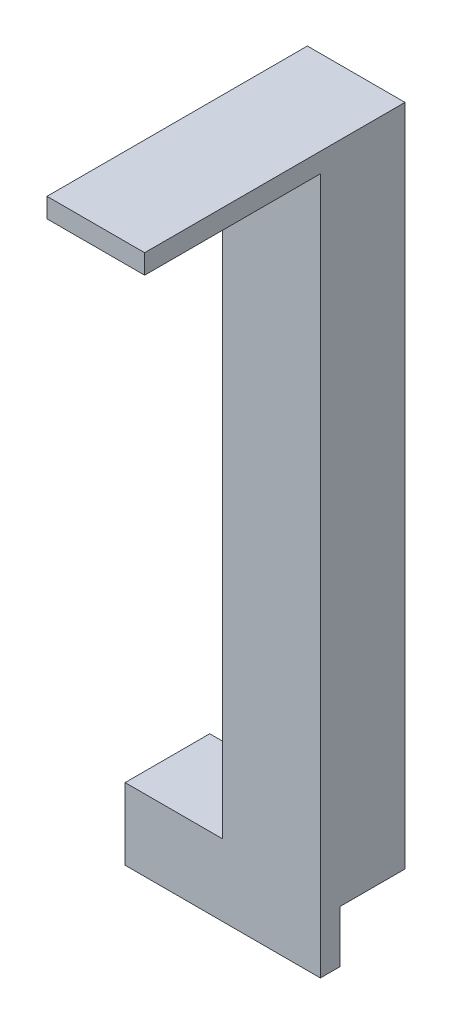
ISO-10303-21;
HEADER;
FILE_DESCRIPTION(('STEP AP214'),'2;1');
FILE_NAME('part.step','',(''),(''),'','','');
FILE_SCHEMA(('AUTOMOTIVE_DESIGN { 1 0 10303 214 1 1 1 1 }'));
ENDSEC;
DATA;
#1=APPLICATION_CONTEXT('core data for automotive mechanical design processes');
#2=APPLICATION_PROTOCOL_DEFINITION('international standard','automotive_design',2000,#1);
#3=PRODUCT_CONTEXT('',#1,'mechanical');
#4=PRODUCT('Part','Part','',(#3));
#5=PRODUCT_RELATED_PRODUCT_CATEGORY('part','',(#4));
#6=PRODUCT_DEFINITION_FORMATION('','',#4);
#7=PRODUCT_DEFINITION_CONTEXT('part definition',#1,'design');
#8=PRODUCT_DEFINITION('design','',#6,#7);
#9=PRODUCT_DEFINITION_SHAPE('','',#8);
#10=(LENGTH_UNIT() NAMED_UNIT(*) SI_UNIT(.MILLI.,.METRE.));
#11=(NAMED_UNIT(*) PLANE_ANGLE_UNIT() SI_UNIT($,.RADIAN.));
#12=(NAMED_UNIT(*) SI_UNIT($,.STERADIAN.) SOLID_ANGLE_UNIT());
#13=UNCERTAINTY_MEASURE_WITH_UNIT(LENGTH_MEASURE(1.E-05),#10,'distance_accuracy_value','');
#14=(GEOMETRIC_REPRESENTATION_CONTEXT(3) GLOBAL_UNCERTAINTY_ASSIGNED_CONTEXT((#13)) GLOBAL_UNIT_ASSIGNED_CONTEXT((#10,
#11,#12)) REPRESENTATION_CONTEXT('',''));
#15=CARTESIAN_POINT('',(0.,0.,0.));
#16=DIRECTION('',(0.,0.,1.));
#17=DIRECTION('',(1.,0.,0.));
#18=AXIS2_PLACEMENT_3D('',#15,#16,#17);
#19=CARTESIAN_POINT('',(0.,-11.,10.));
#20=DIRECTION('',(0.,0.,1.));
#21=DIRECTION('',(1.,0.,0.));
#22=AXIS2_PLACEMENT_3D('',#19,#20,#21);
#23=PLANE('',#22);
#24=DIRECTION('',(0.,1.,0.));
#25=VECTOR('',#24,1.);
#26=CARTESIAN_POINT('',(0.,-11.,10.));
#27=LINE('',#26,#25);
#28=CARTESIAN_POINT('',(0.,-11.,10.));
#29=VERTEX_POINT('',#28);
#30=CARTESIAN_POINT('',(0.,-3.,10.));
#31=VERTEX_POINT('',#30);
#32=EDGE_CURVE('E42',#29,#31,#27,.T.);
#33=ORIENTED_EDGE('',*,*,#32,.T.);
#34=DIRECTION('',(1.,0.,0.));
#35=VECTOR('',#34,1.);
#36=CARTESIAN_POINT('',(0.,-3.,10.));
#37=LINE('',#36,#35);
#38=CARTESIAN_POINT('',(30.,-3.,10.));
#39=VERTEX_POINT('',#38);
#40=EDGE_CURVE('E186',#31,#39,#37,.T.);
#41=ORIENTED_EDGE('',*,*,#40,.T.);
#42=DIRECTION('',(0.,1.,0.));
#43=VECTOR('',#42,1.);
#44=CARTESIAN_POINT('',(30.,-11.,10.));
#45=LINE('',#44,#43);
#46=CARTESIAN_POINT('',(30.,-11.,10.));
#47=VERTEX_POINT('',#46);
#48=EDGE_CURVE('E11',#47,#39,#45,.T.);
#49=ORIENTED_EDGE('',*,*,#48,.F.);
#50=DIRECTION('',(1.,0.,0.));
#51=VECTOR('',#50,1.);
#52=CARTESIAN_POINT('',(0.,-11.,10.));
#53=LINE('',#52,#51);
#54=EDGE_CURVE('E199',#29,#47,#53,.T.);
#55=ORIENTED_EDGE('',*,*,#54,.F.);
#56=EDGE_LOOP('',(#33,#41,#49,#55));
#57=FACE_BOUND('',#56,.T.);
#58=ADVANCED_FACE('F39',(#57),#23,.F.);
#59=CARTESIAN_POINT('',(30.,-11.,0.));
#60=DIRECTION('',(-1.,0.,0.));
#61=DIRECTION('',(0.,0.,1.));
#62=AXIS2_PLACEMENT_3D('',#59,#60,#61);
#63=PLANE('',#62);
#64=DIRECTION('',(0.,1.,0.));
#65=VECTOR('',#64,1.);
#66=CARTESIAN_POINT('',(30.,-3.,0.));
#67=LINE('',#66,#65);
#68=CARTESIAN_POINT('',(30.,-3.,0.));
#69=VERTEX_POINT('',#68);
#70=CARTESIAN_POINT('',(30.,99.,0.));
#71=VERTEX_POINT('',#70);
#72=EDGE_CURVE('E194',#69,#71,#67,.T.);
#73=ORIENTED_EDGE('',*,*,#72,.T.);
#74=DIRECTION('',(0.,0.,1.));
#75=VECTOR('',#74,1.);
#76=CARTESIAN_POINT('',(30.,99.,0.));
#77=LINE('',#76,#75);
#78=CARTESIAN_POINT('',(30.,99.,40.));
#79=VERTEX_POINT('',#78);
#80=EDGE_CURVE('E165',#71,#79,#77,.T.);
#81=ORIENTED_EDGE('',*,*,#80,.T.);
#82=DIRECTION('',(0.,1.,0.));
#83=VECTOR('',#82,1.);
#84=CARTESIAN_POINT('',(30.,96.,40.));
#85=LINE('',#84,#83);
#86=CARTESIAN_POINT('',(30.,96.,40.));
#87=VERTEX_POINT('',#86);
#88=EDGE_CURVE('E161',#87,#79,#85,.T.);
#89=ORIENTED_EDGE('',*,*,#88,.F.);
#90=DIRECTION('',(0.,0.,1.));
#91=VECTOR('',#90,1.);
#92=CARTESIAN_POINT('',(30.,96.,13.));
#93=LINE('',#92,#91);
#94=CARTESIAN_POINT('',(30.,96.,13.));
#95=VERTEX_POINT('',#94);
#96=EDGE_CURVE('E156',#95,#87,#93,.T.);
#97=ORIENTED_EDGE('',*,*,#96,.F.);
#98=DIRECTION('',(0.,1.,0.));
#99=VECTOR('',#98,1.);
#100=CARTESIAN_POINT('',(30.,-11.,13.));
#101=LINE('',#100,#99);
#102=CARTESIAN_POINT('',(30.,-11.,13.));
#103=VERTEX_POINT('',#102);
#104=EDGE_CURVE('E48',#103,#95,#101,.T.);
#105=ORIENTED_EDGE('',*,*,#104,.F.);
#106=DIRECTION('',(0.,0.,1.));
#107=VECTOR('',#106,1.);
#108=CARTESIAN_POINT('',(30.,-11.,0.));
#109=LINE('',#108,#107);
#110=EDGE_CURVE('E213',#47,#103,#109,.T.);
#111=ORIENTED_EDGE('',*,*,#110,.F.);
#112=ORIENTED_EDGE('',*,*,#48,.T.);
#113=DIRECTION('',(0.,0.,1.));
#114=VECTOR('',#113,1.);
#115=CARTESIAN_POINT('',(30.,-3.,0.));
#116=LINE('',#115,#114);
#117=EDGE_CURVE('E64',#69,#39,#116,.T.);
#118=ORIENTED_EDGE('',*,*,#117,.F.);
#119=EDGE_LOOP('',(#73,#81,#89,#97,#105,#111,#112,#118));
#120=FACE_BOUND('',#119,.T.);
#121=ADVANCED_FACE('F236',(#120),#63,.F.);
#122=CARTESIAN_POINT('',(0.,-11.,13.));
#123=DIRECTION('',(0.,0.,1.));
#124=DIRECTION('',(1.,0.,0.));
#125=AXIS2_PLACEMENT_3D('',#122,#123,#124);
#126=PLANE('',#125);
#127=DIRECTION('',(-1.,0.,0.));
#128=VECTOR('',#127,1.);
#129=CARTESIAN_POINT('',(15.,0.,13.));
#130=LINE('',#129,#128);
#131=CARTESIAN_POINT('',(15.,0.,13.));
#132=VERTEX_POINT('',#131);
#133=CARTESIAN_POINT('',(0.,0.,13.));
#134=VERTEX_POINT('',#133);
#135=EDGE_CURVE('E118',#132,#134,#130,.T.);
#136=ORIENTED_EDGE('',*,*,#135,.T.);
#137=DIRECTION('',(0.,1.,0.));
#138=VECTOR('',#137,1.);
#139=CARTESIAN_POINT('',(0.,-11.,13.));
#140=LINE('',#139,#138);
#141=CARTESIAN_POINT('',(0.,-11.,13.));
#142=VERTEX_POINT('',#141);
#143=EDGE_CURVE('E217',#142,#134,#140,.T.);
#144=ORIENTED_EDGE('',*,*,#143,.F.);
#145=DIRECTION('',(1.,0.,0.));
#146=VECTOR('',#145,1.);
#147=CARTESIAN_POINT('',(0.,-11.,13.));
#148=LINE('',#147,#146);
#149=EDGE_CURVE('E209',#142,#103,#148,.T.);
#150=ORIENTED_EDGE('',*,*,#149,.T.);
#151=ORIENTED_EDGE('',*,*,#104,.T.);
#152=DIRECTION('',(-1.,0.,0.));
#153=VECTOR('',#152,1.);
#154=CARTESIAN_POINT('',(30.,96.,13.));
#155=LINE('',#154,#153);
#156=CARTESIAN_POINT('',(15.,96.,13.));
#157=VERTEX_POINT('',#156);
#158=EDGE_CURVE('E138',#95,#157,#155,.T.);
#159=ORIENTED_EDGE('',*,*,#158,.T.);
#160=DIRECTION('',(0.,1.,0.));
#161=VECTOR('',#160,1.);
#162=CARTESIAN_POINT('',(15.,0.,13.));
#163=LINE('',#162,#161);
#164=EDGE_CURVE('E56',#132,#157,#163,.T.);
#165=ORIENTED_EDGE('',*,*,#164,.F.);
#166=EDGE_LOOP('',(#136,#144,#150,#151,#159,#165));
#167=FACE_BOUND('',#166,.T.);
#168=ADVANCED_FACE('F136',(#167),#126,.T.);
#169=CARTESIAN_POINT('',(0.,-11.,0.));
#170=DIRECTION('',(-1.,0.,0.));
#171=DIRECTION('',(0.,0.,1.));
#172=AXIS2_PLACEMENT_3D('',#169,#170,#171);
#173=PLANE('',#172);
#174=DIRECTION('',(0.,0.,1.));
#175=VECTOR('',#174,1.);
#176=CARTESIAN_POINT('',(0.,0.,13.));
#177=LINE('',#176,#175);
#178=CARTESIAN_POINT('',(0.,0.,0.));
#179=VERTEX_POINT('',#178);
#180=EDGE_CURVE('E123',#179,#134,#177,.T.);
#181=ORIENTED_EDGE('',*,*,#180,.F.);
#182=DIRECTION('',(0.,1.,0.));
#183=VECTOR('',#182,1.);
#184=CARTESIAN_POINT('',(0.,-3.,0.));
#185=LINE('',#184,#183);
#186=CARTESIAN_POINT('',(0.,-3.,0.));
#187=VERTEX_POINT('',#186);
#188=EDGE_CURVE('E195',#187,#179,#185,.T.);
#189=ORIENTED_EDGE('',*,*,#188,.F.);
#190=DIRECTION('',(0.,0.,1.));
#191=VECTOR('',#190,1.);
#192=CARTESIAN_POINT('',(0.,-3.,0.));
#193=LINE('',#192,#191);
#194=EDGE_CURVE('E172',#187,#31,#193,.T.);
#195=ORIENTED_EDGE('',*,*,#194,.T.);
#196=ORIENTED_EDGE('',*,*,#32,.F.);
#197=DIRECTION('',(0.,0.,1.));
#198=VECTOR('',#197,1.);
#199=CARTESIAN_POINT('',(0.,-11.,0.));
#200=LINE('',#199,#198);
#201=EDGE_CURVE('E205',#29,#142,#200,.T.);
#202=ORIENTED_EDGE('',*,*,#201,.T.);
#203=ORIENTED_EDGE('',*,*,#143,.T.);
#204=EDGE_LOOP('',(#181,#189,#195,#196,#202,#203));
#205=FACE_BOUND('',#204,.T.);
#206=ADVANCED_FACE('F226',(#205),#173,.T.);
#207=CARTESIAN_POINT('',(0.,-11.,0.));
#208=DIRECTION('',(0.,1.,0.));
#209=DIRECTION('',(0.,0.,1.));
#210=AXIS2_PLACEMENT_3D('',#207,#208,#209);
#211=PLANE('',#210);
#212=ORIENTED_EDGE('',*,*,#54,.T.);
#213=ORIENTED_EDGE('',*,*,#110,.T.);
#214=ORIENTED_EDGE('',*,*,#149,.F.);
#215=ORIENTED_EDGE('',*,*,#201,.F.);
#216=EDGE_LOOP('',(#212,#213,#214,#215));
#217=FACE_BOUND('',#216,.T.);
#218=ADVANCED_FACE('F241',(#217),#211,.F.);
#219=CARTESIAN_POINT('',(0.,-3.,0.));
#220=DIRECTION('',(0.,0.,1.));
#221=DIRECTION('',(1.,0.,0.));
#222=AXIS2_PLACEMENT_3D('',#219,#220,#221);
#223=PLANE('',#222);
#224=ORIENTED_EDGE('',*,*,#188,.T.);
#225=DIRECTION('',(-1.,0.,0.));
#226=VECTOR('',#225,1.);
#227=CARTESIAN_POINT('',(15.,0.,0.));
#228=LINE('',#227,#226);
#229=CARTESIAN_POINT('',(15.,0.,0.));
#230=VERTEX_POINT('',#229);
#231=EDGE_CURVE('E127',#230,#179,#228,.T.);
#232=ORIENTED_EDGE('',*,*,#231,.F.);
#233=DIRECTION('',(0.,-1.,0.));
#234=VECTOR('',#233,1.);
#235=CARTESIAN_POINT('',(15.,0.,0.));
#236=LINE('',#235,#234);
#237=CARTESIAN_POINT('',(15.,99.,0.));
#238=VERTEX_POINT('',#237);
#239=EDGE_CURVE('E128',#238,#230,#236,.T.);
#240=ORIENTED_EDGE('',*,*,#239,.F.);
#241=DIRECTION('',(-1.,0.,0.));
#242=VECTOR('',#241,1.);
#243=CARTESIAN_POINT('',(30.,99.,0.));
#244=LINE('',#243,#242);
#245=EDGE_CURVE('E168',#71,#238,#244,.T.);
#246=ORIENTED_EDGE('',*,*,#245,.F.);
#247=ORIENTED_EDGE('',*,*,#72,.F.);
#248=DIRECTION('',(1.,0.,0.));
#249=VECTOR('',#248,1.);
#250=CARTESIAN_POINT('',(0.,-3.,0.));
#251=LINE('',#250,#249);
#252=EDGE_CURVE('E191',#187,#69,#251,.T.);
#253=ORIENTED_EDGE('',*,*,#252,.F.);
#254=EDGE_LOOP('',(#224,#232,#240,#246,#247,#253));
#255=FACE_BOUND('',#254,.T.);
#256=ADVANCED_FACE('F233',(#255),#223,.F.);
#257=CARTESIAN_POINT('',(0.,-3.,0.));
#258=DIRECTION('',(0.,1.,0.));
#259=DIRECTION('',(0.,0.,1.));
#260=AXIS2_PLACEMENT_3D('',#257,#258,#259);
#261=PLANE('',#260);
#262=ORIENTED_EDGE('',*,*,#194,.F.);
#263=ORIENTED_EDGE('',*,*,#252,.T.);
#264=ORIENTED_EDGE('',*,*,#117,.T.);
#265=ORIENTED_EDGE('',*,*,#40,.F.);
#266=EDGE_LOOP('',(#262,#263,#264,#265));
#267=FACE_BOUND('',#266,.T.);
#268=ADVANCED_FACE('F229',(#267),#261,.F.);
#269=CARTESIAN_POINT('',(30.,99.,0.));
#270=DIRECTION('',(0.,-1.,0.));
#271=DIRECTION('',(0.,0.,-1.));
#272=AXIS2_PLACEMENT_3D('',#269,#270,#271);
#273=PLANE('',#272);
#274=ORIENTED_EDGE('',*,*,#245,.T.);
#275=DIRECTION('',(0.,0.,-1.));
#276=VECTOR('',#275,1.);
#277=CARTESIAN_POINT('',(15.,99.,0.));
#278=LINE('',#277,#276);
#279=CARTESIAN_POINT('',(15.,99.,40.));
#280=VERTEX_POINT('',#279);
#281=EDGE_CURVE('E148',#280,#238,#278,.T.);
#282=ORIENTED_EDGE('',*,*,#281,.F.);
#283=DIRECTION('',(-1.,0.,0.));
#284=VECTOR('',#283,1.);
#285=CARTESIAN_POINT('',(30.,99.,40.));
#286=LINE('',#285,#284);
#287=EDGE_CURVE('E173',#79,#280,#286,.T.);
#288=ORIENTED_EDGE('',*,*,#287,.F.);
#289=ORIENTED_EDGE('',*,*,#80,.F.);
#290=EDGE_LOOP('',(#274,#282,#288,#289));
#291=FACE_BOUND('',#290,.T.);
#292=ADVANCED_FACE('F251',(#291),#273,.F.);
#293=CARTESIAN_POINT('',(30.,96.,40.));
#294=DIRECTION('',(0.,0.,1.));
#295=DIRECTION('',(1.,0.,0.));
#296=AXIS2_PLACEMENT_3D('',#293,#294,#295);
#297=PLANE('',#296);
#298=DIRECTION('',(0.,1.,0.));
#299=VECTOR('',#298,1.);
#300=CARTESIAN_POINT('',(15.,96.,40.));
#301=LINE('',#300,#299);
#302=CARTESIAN_POINT('',(15.,96.,40.));
#303=VERTEX_POINT('',#302);
#304=EDGE_CURVE('E143',#303,#280,#301,.T.);
#305=ORIENTED_EDGE('',*,*,#304,.F.);
#306=DIRECTION('',(-1.,0.,0.));
#307=VECTOR('',#306,1.);
#308=CARTESIAN_POINT('',(30.,96.,40.));
#309=LINE('',#308,#307);
#310=EDGE_CURVE('E177',#87,#303,#309,.T.);
#311=ORIENTED_EDGE('',*,*,#310,.F.);
#312=ORIENTED_EDGE('',*,*,#88,.T.);
#313=ORIENTED_EDGE('',*,*,#287,.T.);
#314=EDGE_LOOP('',(#305,#311,#312,#313));
#315=FACE_BOUND('',#314,.T.);
#316=ADVANCED_FACE('F248',(#315),#297,.T.);
#317=CARTESIAN_POINT('',(30.,96.,13.));
#318=DIRECTION('',(0.,-1.,0.));
#319=DIRECTION('',(0.,0.,-1.));
#320=AXIS2_PLACEMENT_3D('',#317,#318,#319);
#321=PLANE('',#320);
#322=DIRECTION('',(0.,0.,1.));
#323=VECTOR('',#322,1.);
#324=CARTESIAN_POINT('',(15.,96.,13.));
#325=LINE('',#324,#323);
#326=EDGE_CURVE('E140',#157,#303,#325,.T.);
#327=ORIENTED_EDGE('',*,*,#326,.F.);
#328=ORIENTED_EDGE('',*,*,#158,.F.);
#329=ORIENTED_EDGE('',*,*,#96,.T.);
#330=ORIENTED_EDGE('',*,*,#310,.T.);
#331=EDGE_LOOP('',(#327,#328,#329,#330));
#332=FACE_BOUND('',#331,.T.);
#333=ADVANCED_FACE('F243',(#332),#321,.T.);
#334=CARTESIAN_POINT('',(15.,0.,13.));
#335=DIRECTION('',(0.,-1.,0.));
#336=DIRECTION('',(0.,0.,-1.));
#337=AXIS2_PLACEMENT_3D('',#334,#335,#336);
#338=PLANE('',#337);
#339=ORIENTED_EDGE('',*,*,#180,.T.);
#340=ORIENTED_EDGE('',*,*,#135,.F.);
#341=DIRECTION('',(0.,0.,1.));
#342=VECTOR('',#341,1.);
#343=CARTESIAN_POINT('',(15.,0.,13.));
#344=LINE('',#343,#342);
#345=EDGE_CURVE('E120',#230,#132,#344,.T.);
#346=ORIENTED_EDGE('',*,*,#345,.F.);
#347=ORIENTED_EDGE('',*,*,#231,.T.);
#348=EDGE_LOOP('',(#339,#340,#346,#347));
#349=FACE_BOUND('',#348,.T.);
#350=ADVANCED_FACE('F119',(#349),#338,.F.);
#351=CARTESIAN_POINT('',(15.,0.,0.));
#352=DIRECTION('',(1.,0.,0.));
#353=DIRECTION('',(0.,0.,-1.));
#354=AXIS2_PLACEMENT_3D('',#351,#352,#353);
#355=PLANE('',#354);
#356=ORIENTED_EDGE('',*,*,#345,.T.);
#357=ORIENTED_EDGE('',*,*,#164,.T.);
#358=ORIENTED_EDGE('',*,*,#326,.T.);
#359=ORIENTED_EDGE('',*,*,#304,.T.);
#360=ORIENTED_EDGE('',*,*,#281,.T.);
#361=ORIENTED_EDGE('',*,*,#239,.T.);
#362=EDGE_LOOP('',(#356,#357,#358,#359,#360,#361));
#363=FACE_BOUND('',#362,.T.);
#364=ADVANCED_FACE('F130',(#363),#355,.F.);
#365=CLOSED_SHELL('',(#58,#121,#168,#206,#218,#256,#268,#292,#316,#333,#350,#364));
#366=MANIFOLD_SOLID_BREP('B2',#365);
#367=ADVANCED_BREP_SHAPE_REPRESENTATION('',(#18,#366),#14);
#368=SHAPE_DEFINITION_REPRESENTATION(#9,#367);
ENDSEC;
END-ISO-10303-21;
